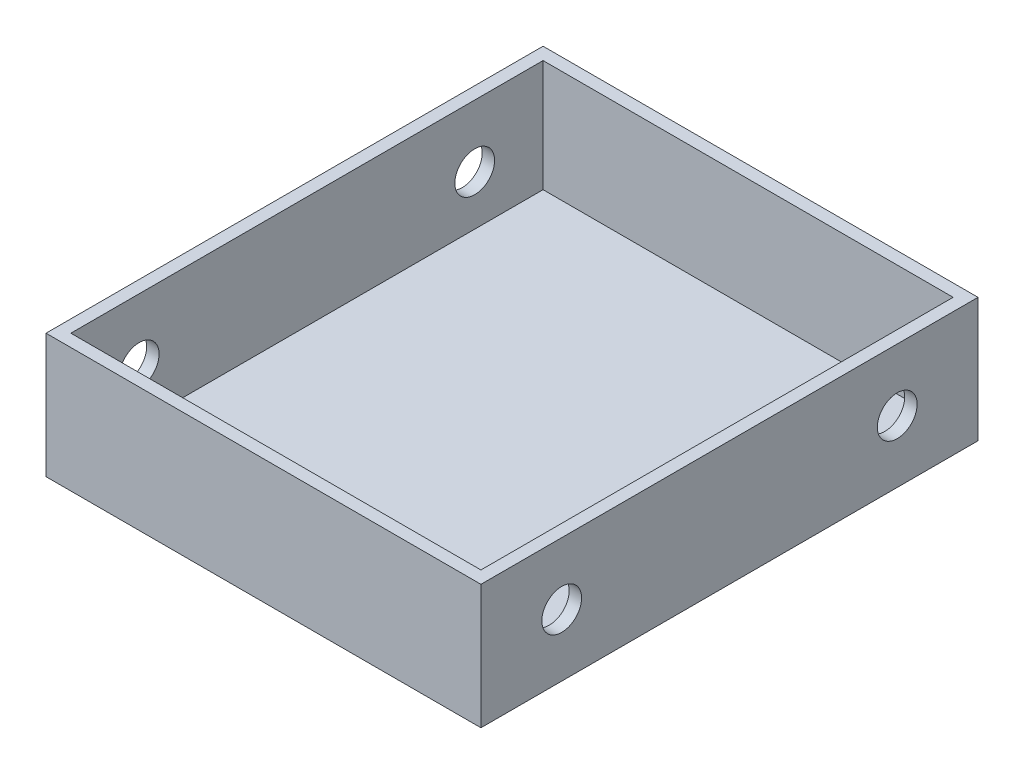
ISO-10303-21;
HEADER;
FILE_DESCRIPTION(('STEP AP214'),'2;1');
FILE_NAME('part.step','',(''),(''),'','','');
FILE_SCHEMA(('AUTOMOTIVE_DESIGN { 1 0 10303 214 1 1 1 1 }'));
ENDSEC;
DATA;
#1=APPLICATION_CONTEXT('core data for automotive mechanical design processes');
#2=APPLICATION_PROTOCOL_DEFINITION('international standard','automotive_design',2000,#1);
#3=PRODUCT_CONTEXT('',#1,'mechanical');
#4=PRODUCT('Part','Part','',(#3));
#5=PRODUCT_RELATED_PRODUCT_CATEGORY('part','',(#4));
#6=PRODUCT_DEFINITION_FORMATION('','',#4);
#7=PRODUCT_DEFINITION_CONTEXT('part definition',#1,'design');
#8=PRODUCT_DEFINITION('design','',#6,#7);
#9=PRODUCT_DEFINITION_SHAPE('','',#8);
#10=(LENGTH_UNIT() NAMED_UNIT(*) SI_UNIT(.MILLI.,.METRE.));
#11=(NAMED_UNIT(*) PLANE_ANGLE_UNIT() SI_UNIT($,.RADIAN.));
#12=(NAMED_UNIT(*) SI_UNIT($,.STERADIAN.) SOLID_ANGLE_UNIT());
#13=UNCERTAINTY_MEASURE_WITH_UNIT(LENGTH_MEASURE(1.E-05),#10,'distance_accuracy_value','');
#14=(GEOMETRIC_REPRESENTATION_CONTEXT(3) GLOBAL_UNCERTAINTY_ASSIGNED_CONTEXT((#13)) GLOBAL_UNIT_ASSIGNED_CONTEXT((#10,
#11,#12)) REPRESENTATION_CONTEXT('',''));
#15=CARTESIAN_POINT('',(0.,0.,0.));
#16=DIRECTION('',(0.,0.,1.));
#17=DIRECTION('',(1.,0.,0.));
#18=AXIS2_PLACEMENT_3D('',#15,#16,#17);
#19=CARTESIAN_POINT('',(0.,10.,0.));
#20=DIRECTION('',(0.,-1.,0.));
#21=DIRECTION('',(0.,0.,-1.));
#22=AXIS2_PLACEMENT_3D('',#19,#20,#21);
#23=PLANE('',#22);
#24=DIRECTION('',(0.,0.,1.));
#25=VECTOR('',#24,1.);
#26=CARTESIAN_POINT('',(0.,10.,0.));
#27=LINE('',#26,#25);
#28=CARTESIAN_POINT('',(0.,10.,-40.));
#29=VERTEX_POINT('',#28);
#30=CARTESIAN_POINT('',(0.,10.,0.));
#31=VERTEX_POINT('',#30);
#32=EDGE_CURVE('E145',#29,#31,#27,.T.);
#33=ORIENTED_EDGE('',*,*,#32,.T.);
#34=DIRECTION('',(1.,0.,0.));
#35=VECTOR('',#34,1.);
#36=CARTESIAN_POINT('',(0.,10.,0.));
#37=LINE('',#36,#35);
#38=CARTESIAN_POINT('',(35.,10.,0.));
#39=VERTEX_POINT('',#38);
#40=EDGE_CURVE('E89',#31,#39,#37,.T.);
#41=ORIENTED_EDGE('',*,*,#40,.T.);
#42=DIRECTION('',(0.,0.,-1.));
#43=VECTOR('',#42,1.);
#44=CARTESIAN_POINT('',(35.,10.,0.));
#45=LINE('',#44,#43);
#46=CARTESIAN_POINT('',(35.,10.,-40.));
#47=VERTEX_POINT('',#46);
#48=EDGE_CURVE('E148',#39,#47,#45,.T.);
#49=ORIENTED_EDGE('',*,*,#48,.T.);
#50=DIRECTION('',(-1.,0.,0.));
#51=VECTOR('',#50,1.);
#52=CARTESIAN_POINT('',(0.,10.,-40.));
#53=LINE('',#52,#51);
#54=EDGE_CURVE('E61',#47,#29,#53,.T.);
#55=ORIENTED_EDGE('',*,*,#54,.T.);
#56=EDGE_LOOP('',(#33,#41,#49,#55));
#57=FACE_BOUND('',#56,.T.);
#58=DIRECTION('',(0.,0.,1.));
#59=VECTOR('',#58,1.);
#60=CARTESIAN_POINT('',(1.,10.,0.));
#61=LINE('',#60,#59);
#62=CARTESIAN_POINT('',(0.999999999999993,10.,-39.));
#63=VERTEX_POINT('',#62);
#64=CARTESIAN_POINT('',(1.,10.,-1.));
#65=VERTEX_POINT('',#64);
#66=EDGE_CURVE('E134',#63,#65,#61,.T.);
#67=ORIENTED_EDGE('',*,*,#66,.F.);
#68=DIRECTION('',(-1.,0.,0.));
#69=VECTOR('',#68,1.);
#70=CARTESIAN_POINT('',(0.,10.,-39.));
#71=LINE('',#70,#69);
#72=CARTESIAN_POINT('',(34.,10.,-39.));
#73=VERTEX_POINT('',#72);
#74=EDGE_CURVE('E143',#73,#63,#71,.T.);
#75=ORIENTED_EDGE('',*,*,#74,.F.);
#76=DIRECTION('',(0.,0.,-1.));
#77=VECTOR('',#76,1.);
#78=CARTESIAN_POINT('',(34.,10.,0.));
#79=LINE('',#78,#77);
#80=CARTESIAN_POINT('',(34.,10.,-1.));
#81=VERTEX_POINT('',#80);
#82=EDGE_CURVE('E141',#81,#73,#79,.T.);
#83=ORIENTED_EDGE('',*,*,#82,.F.);
#84=DIRECTION('',(1.,0.,0.));
#85=VECTOR('',#84,1.);
#86=CARTESIAN_POINT('',(0.,10.,-1.));
#87=LINE('',#86,#85);
#88=EDGE_CURVE('E126',#65,#81,#87,.T.);
#89=ORIENTED_EDGE('',*,*,#88,.F.);
#90=EDGE_LOOP('',(#67,#75,#83,#89));
#91=FACE_BOUND('',#90,.T.);
#92=ADVANCED_FACE('F35',(#57,#91),#23,.F.);
#93=CARTESIAN_POINT('',(0.,10.,0.));
#94=DIRECTION('',(1.,0.,0.));
#95=DIRECTION('',(0.,0.,-1.));
#96=AXIS2_PLACEMENT_3D('',#93,#94,#95);
#97=PLANE('',#96);
#98=CARTESIAN_POINT('',(0.,5.,-33.5));
#99=DIRECTION('',(-1.,0.,0.));
#100=DIRECTION('',(0.,0.,1.));
#101=AXIS2_PLACEMENT_3D('',#98,#99,#100);
#102=CIRCLE('',#101,1.6);
#103=CARTESIAN_POINT('',(0.,5.,-31.9));
#104=VERTEX_POINT('',#103);
#105=EDGE_CURVE('E173',#104,#104,#102,.T.);
#106=ORIENTED_EDGE('',*,*,#105,.F.);
#107=EDGE_LOOP('',(#106));
#108=FACE_BOUND('',#107,.T.);
#109=CARTESIAN_POINT('',(0.,5.,-6.5));
#110=DIRECTION('',(-1.,0.,0.));
#111=DIRECTION('',(0.,0.,-1.));
#112=AXIS2_PLACEMENT_3D('',#109,#110,#111);
#113=CIRCLE('',#112,1.6);
#114=CARTESIAN_POINT('',(0.,5.,-8.1));
#115=VERTEX_POINT('',#114);
#116=EDGE_CURVE('E183',#115,#115,#113,.T.);
#117=ORIENTED_EDGE('',*,*,#116,.F.);
#118=EDGE_LOOP('',(#117));
#119=FACE_BOUND('',#118,.T.);
#120=DIRECTION('',(0.,0.,1.));
#121=VECTOR('',#120,1.);
#122=CARTESIAN_POINT('',(0.,0.,0.));
#123=LINE('',#122,#121);
#124=CARTESIAN_POINT('',(0.,0.,-40.));
#125=VERTEX_POINT('',#124);
#126=CARTESIAN_POINT('',(0.,0.,0.));
#127=VERTEX_POINT('',#126);
#128=EDGE_CURVE('E152',#125,#127,#123,.T.);
#129=ORIENTED_EDGE('',*,*,#128,.T.);
#130=DIRECTION('',(0.,-1.,0.));
#131=VECTOR('',#130,1.);
#132=CARTESIAN_POINT('',(0.,10.,0.));
#133=LINE('',#132,#131);
#134=EDGE_CURVE('E11',#31,#127,#133,.T.);
#135=ORIENTED_EDGE('',*,*,#134,.F.);
#136=ORIENTED_EDGE('',*,*,#32,.F.);
#137=DIRECTION('',(0.,-1.,0.));
#138=VECTOR('',#137,1.);
#139=CARTESIAN_POINT('',(0.,10.,-40.));
#140=LINE('',#139,#138);
#141=EDGE_CURVE('E151',#29,#125,#140,.T.);
#142=ORIENTED_EDGE('',*,*,#141,.T.);
#143=EDGE_LOOP('',(#129,#135,#136,#142));
#144=FACE_BOUND('',#143,.T.);
#145=ADVANCED_FACE('F37',(#108,#119,#144),#97,.F.);
#146=CARTESIAN_POINT('',(0.,10.,0.));
#147=DIRECTION('',(0.,0.,-1.));
#148=DIRECTION('',(-1.,0.,0.));
#149=AXIS2_PLACEMENT_3D('',#146,#147,#148);
#150=PLANE('',#149);
#151=DIRECTION('',(1.,0.,0.));
#152=VECTOR('',#151,1.);
#153=CARTESIAN_POINT('',(0.,0.,0.));
#154=LINE('',#153,#152);
#155=CARTESIAN_POINT('',(35.,0.,0.));
#156=VERTEX_POINT('',#155);
#157=EDGE_CURVE('E155',#127,#156,#154,.T.);
#158=ORIENTED_EDGE('',*,*,#157,.T.);
#159=DIRECTION('',(0.,-1.,0.));
#160=VECTOR('',#159,1.);
#161=CARTESIAN_POINT('',(35.,10.,0.));
#162=LINE('',#161,#160);
#163=EDGE_CURVE('E44',#39,#156,#162,.T.);
#164=ORIENTED_EDGE('',*,*,#163,.F.);
#165=ORIENTED_EDGE('',*,*,#40,.F.);
#166=ORIENTED_EDGE('',*,*,#134,.T.);
#167=EDGE_LOOP('',(#158,#164,#165,#166));
#168=FACE_BOUND('',#167,.T.);
#169=ADVANCED_FACE('F204',(#168),#150,.F.);
#170=CARTESIAN_POINT('',(35.,10.,0.));
#171=DIRECTION('',(-1.,0.,0.));
#172=DIRECTION('',(0.,0.,1.));
#173=AXIS2_PLACEMENT_3D('',#170,#171,#172);
#174=PLANE('',#173);
#175=CARTESIAN_POINT('',(35.,5.,-33.5));
#176=DIRECTION('',(-1.,0.,0.));
#177=DIRECTION('',(0.,0.,1.));
#178=AXIS2_PLACEMENT_3D('',#175,#176,#177);
#179=CIRCLE('',#178,1.6);
#180=CARTESIAN_POINT('',(35.,5.,-31.9));
#181=VERTEX_POINT('',#180);
#182=EDGE_CURVE('E167',#181,#181,#179,.T.);
#183=ORIENTED_EDGE('',*,*,#182,.T.);
#184=EDGE_LOOP('',(#183));
#185=FACE_BOUND('',#184,.T.);
#186=CARTESIAN_POINT('',(35.,5.,-6.50000000000002));
#187=DIRECTION('',(-1.,0.,0.));
#188=DIRECTION('',(0.,0.,-1.));
#189=AXIS2_PLACEMENT_3D('',#186,#187,#188);
#190=CIRCLE('',#189,1.6);
#191=CARTESIAN_POINT('',(35.,5.,-8.10000000000002));
#192=VERTEX_POINT('',#191);
#193=EDGE_CURVE('E178',#192,#192,#190,.T.);
#194=ORIENTED_EDGE('',*,*,#193,.T.);
#195=EDGE_LOOP('',(#194));
#196=FACE_BOUND('',#195,.T.);
#197=DIRECTION('',(0.,0.,-1.));
#198=VECTOR('',#197,1.);
#199=CARTESIAN_POINT('',(35.,0.,0.));
#200=LINE('',#199,#198);
#201=CARTESIAN_POINT('',(35.,0.,-40.));
#202=VERTEX_POINT('',#201);
#203=EDGE_CURVE('E157',#156,#202,#200,.T.);
#204=ORIENTED_EDGE('',*,*,#203,.T.);
#205=DIRECTION('',(0.,-1.,0.));
#206=VECTOR('',#205,1.);
#207=CARTESIAN_POINT('',(35.,10.,-40.));
#208=LINE('',#207,#206);
#209=EDGE_CURVE('E161',#47,#202,#208,.T.);
#210=ORIENTED_EDGE('',*,*,#209,.F.);
#211=ORIENTED_EDGE('',*,*,#48,.F.);
#212=ORIENTED_EDGE('',*,*,#163,.T.);
#213=EDGE_LOOP('',(#204,#210,#211,#212));
#214=FACE_BOUND('',#213,.T.);
#215=ADVANCED_FACE('F216',(#185,#196,#214),#174,.F.);
#216=CARTESIAN_POINT('',(0.,10.,-40.));
#217=DIRECTION('',(0.,0.,1.));
#218=DIRECTION('',(1.,0.,0.));
#219=AXIS2_PLACEMENT_3D('',#216,#217,#218);
#220=PLANE('',#219);
#221=DIRECTION('',(-1.,0.,0.));
#222=VECTOR('',#221,1.);
#223=CARTESIAN_POINT('',(0.,0.,-40.));
#224=LINE('',#223,#222);
#225=EDGE_CURVE('E82',#202,#125,#224,.T.);
#226=ORIENTED_EDGE('',*,*,#225,.T.);
#227=ORIENTED_EDGE('',*,*,#141,.F.);
#228=ORIENTED_EDGE('',*,*,#54,.F.);
#229=ORIENTED_EDGE('',*,*,#209,.T.);
#230=EDGE_LOOP('',(#226,#227,#228,#229));
#231=FACE_BOUND('',#230,.T.);
#232=ADVANCED_FACE('F212',(#231),#220,.F.);
#233=CARTESIAN_POINT('',(0.,0.,0.));
#234=DIRECTION('',(0.,-1.,0.));
#235=DIRECTION('',(0.,0.,-1.));
#236=AXIS2_PLACEMENT_3D('',#233,#234,#235);
#237=PLANE('',#236);
#238=ORIENTED_EDGE('',*,*,#128,.F.);
#239=ORIENTED_EDGE('',*,*,#225,.F.);
#240=ORIENTED_EDGE('',*,*,#203,.F.);
#241=ORIENTED_EDGE('',*,*,#157,.F.);
#242=EDGE_LOOP('',(#238,#239,#240,#241));
#243=FACE_BOUND('',#242,.T.);
#244=ADVANCED_FACE('F209',(#243),#237,.T.);
#245=CARTESIAN_POINT('',(1.,10.,0.));
#246=DIRECTION('',(1.,0.,0.));
#247=DIRECTION('',(0.,0.,-1.));
#248=AXIS2_PLACEMENT_3D('',#245,#246,#247);
#249=PLANE('',#248);
#250=CARTESIAN_POINT('',(0.999999999999994,5.,-33.5));
#251=DIRECTION('',(1.,0.,0.));
#252=DIRECTION('',(0.,0.,-1.));
#253=AXIS2_PLACEMENT_3D('',#250,#251,#252);
#254=CIRCLE('',#253,1.6);
#255=CARTESIAN_POINT('',(0.999999999999994,5.,-35.1));
#256=VERTEX_POINT('',#255);
#257=EDGE_CURVE('E186',#256,#256,#254,.T.);
#258=ORIENTED_EDGE('',*,*,#257,.F.);
#259=EDGE_LOOP('',(#258));
#260=FACE_BOUND('',#259,.T.);
#261=CARTESIAN_POINT('',(1.,5.,-6.5));
#262=DIRECTION('',(1.,0.,0.));
#263=DIRECTION('',(0.,0.,-1.));
#264=AXIS2_PLACEMENT_3D('',#261,#262,#263);
#265=CIRCLE('',#264,1.6);
#266=CARTESIAN_POINT('',(1.,5.,-8.1));
#267=VERTEX_POINT('',#266);
#268=EDGE_CURVE('E166',#267,#267,#265,.T.);
#269=ORIENTED_EDGE('',*,*,#268,.F.);
#270=EDGE_LOOP('',(#269));
#271=FACE_BOUND('',#270,.T.);
#272=DIRECTION('',(0.,0.,1.));
#273=VECTOR('',#272,1.);
#274=CARTESIAN_POINT('',(1.,1.,0.));
#275=LINE('',#274,#273);
#276=CARTESIAN_POINT('',(0.999999999999993,1.,-39.));
#277=VERTEX_POINT('',#276);
#278=CARTESIAN_POINT('',(1.,1.,-1.));
#279=VERTEX_POINT('',#278);
#280=EDGE_CURVE('E117',#277,#279,#275,.T.);
#281=ORIENTED_EDGE('',*,*,#280,.F.);
#282=DIRECTION('',(0.,-1.,0.));
#283=VECTOR('',#282,1.);
#284=CARTESIAN_POINT('',(0.999999999999993,10.,-39.));
#285=LINE('',#284,#283);
#286=EDGE_CURVE('E137',#63,#277,#285,.T.);
#287=ORIENTED_EDGE('',*,*,#286,.F.);
#288=ORIENTED_EDGE('',*,*,#66,.T.);
#289=DIRECTION('',(0.,-1.,0.));
#290=VECTOR('',#289,1.);
#291=CARTESIAN_POINT('',(1.,10.,-1.));
#292=LINE('',#291,#290);
#293=EDGE_CURVE('E129',#65,#279,#292,.T.);
#294=ORIENTED_EDGE('',*,*,#293,.T.);
#295=EDGE_LOOP('',(#281,#287,#288,#294));
#296=FACE_BOUND('',#295,.T.);
#297=ADVANCED_FACE('F197',(#260,#271,#296),#249,.T.);
#298=CARTESIAN_POINT('',(0.,10.,-1.));
#299=DIRECTION('',(0.,0.,-1.));
#300=DIRECTION('',(-1.,0.,0.));
#301=AXIS2_PLACEMENT_3D('',#298,#299,#300);
#302=PLANE('',#301);
#303=DIRECTION('',(1.,0.,0.));
#304=VECTOR('',#303,1.);
#305=CARTESIAN_POINT('',(0.,1.,-1.));
#306=LINE('',#305,#304);
#307=CARTESIAN_POINT('',(34.,1.,-1.));
#308=VERTEX_POINT('',#307);
#309=EDGE_CURVE('E111',#279,#308,#306,.T.);
#310=ORIENTED_EDGE('',*,*,#309,.F.);
#311=ORIENTED_EDGE('',*,*,#293,.F.);
#312=ORIENTED_EDGE('',*,*,#88,.T.);
#313=DIRECTION('',(0.,-1.,0.));
#314=VECTOR('',#313,1.);
#315=CARTESIAN_POINT('',(34.,10.,-1.));
#316=LINE('',#315,#314);
#317=EDGE_CURVE('E123',#81,#308,#316,.T.);
#318=ORIENTED_EDGE('',*,*,#317,.T.);
#319=EDGE_LOOP('',(#310,#311,#312,#318));
#320=FACE_BOUND('',#319,.T.);
#321=ADVANCED_FACE('F124',(#320),#302,.T.);
#322=CARTESIAN_POINT('',(34.,10.,0.));
#323=DIRECTION('',(-1.,0.,0.));
#324=DIRECTION('',(0.,0.,1.));
#325=AXIS2_PLACEMENT_3D('',#322,#323,#324);
#326=PLANE('',#325);
#327=CARTESIAN_POINT('',(34.,5.,-33.5));
#328=DIRECTION('',(-1.,0.,0.));
#329=DIRECTION('',(0.,0.,1.));
#330=AXIS2_PLACEMENT_3D('',#327,#328,#329);
#331=CIRCLE('',#330,1.6);
#332=CARTESIAN_POINT('',(34.,5.,-31.9));
#333=VERTEX_POINT('',#332);
#334=EDGE_CURVE('E39',#333,#333,#331,.T.);
#335=ORIENTED_EDGE('',*,*,#334,.F.);
#336=EDGE_LOOP('',(#335));
#337=FACE_BOUND('',#336,.T.);
#338=CARTESIAN_POINT('',(34.,5.,-6.50000000000002));
#339=DIRECTION('',(-1.,0.,0.));
#340=DIRECTION('',(0.,0.,1.));
#341=AXIS2_PLACEMENT_3D('',#338,#339,#340);
#342=CIRCLE('',#341,1.6);
#343=CARTESIAN_POINT('',(34.,5.,-4.90000000000002));
#344=VERTEX_POINT('',#343);
#345=EDGE_CURVE('E164',#344,#344,#342,.T.);
#346=ORIENTED_EDGE('',*,*,#345,.F.);
#347=EDGE_LOOP('',(#346));
#348=FACE_BOUND('',#347,.T.);
#349=DIRECTION('',(0.,0.,-1.));
#350=VECTOR('',#349,1.);
#351=CARTESIAN_POINT('',(34.,1.,0.));
#352=LINE('',#351,#350);
#353=CARTESIAN_POINT('',(34.,1.,-39.));
#354=VERTEX_POINT('',#353);
#355=EDGE_CURVE('E115',#308,#354,#352,.T.);
#356=ORIENTED_EDGE('',*,*,#355,.F.);
#357=ORIENTED_EDGE('',*,*,#317,.F.);
#358=ORIENTED_EDGE('',*,*,#82,.T.);
#359=DIRECTION('',(0.,-1.,0.));
#360=VECTOR('',#359,1.);
#361=CARTESIAN_POINT('',(34.,10.,-39.));
#362=LINE('',#361,#360);
#363=EDGE_CURVE('E52',#73,#354,#362,.T.);
#364=ORIENTED_EDGE('',*,*,#363,.T.);
#365=EDGE_LOOP('',(#356,#357,#358,#364));
#366=FACE_BOUND('',#365,.T.);
#367=ADVANCED_FACE('F131',(#337,#348,#366),#326,.T.);
#368=CARTESIAN_POINT('',(0.,10.,-39.));
#369=DIRECTION('',(0.,0.,1.));
#370=DIRECTION('',(1.,0.,0.));
#371=AXIS2_PLACEMENT_3D('',#368,#369,#370);
#372=PLANE('',#371);
#373=DIRECTION('',(-1.,0.,0.));
#374=VECTOR('',#373,1.);
#375=CARTESIAN_POINT('',(0.,1.,-39.));
#376=LINE('',#375,#374);
#377=EDGE_CURVE('E132',#354,#277,#376,.T.);
#378=ORIENTED_EDGE('',*,*,#377,.F.);
#379=ORIENTED_EDGE('',*,*,#363,.F.);
#380=ORIENTED_EDGE('',*,*,#74,.T.);
#381=ORIENTED_EDGE('',*,*,#286,.T.);
#382=EDGE_LOOP('',(#378,#379,#380,#381));
#383=FACE_BOUND('',#382,.T.);
#384=ADVANCED_FACE('F193',(#383),#372,.T.);
#385=CARTESIAN_POINT('',(0.,1.,0.));
#386=DIRECTION('',(0.,-1.,0.));
#387=DIRECTION('',(0.,0.,-1.));
#388=AXIS2_PLACEMENT_3D('',#385,#386,#387);
#389=PLANE('',#388);
#390=ORIENTED_EDGE('',*,*,#280,.T.);
#391=ORIENTED_EDGE('',*,*,#309,.T.);
#392=ORIENTED_EDGE('',*,*,#355,.T.);
#393=ORIENTED_EDGE('',*,*,#377,.T.);
#394=EDGE_LOOP('',(#390,#391,#392,#393));
#395=FACE_BOUND('',#394,.T.);
#396=ADVANCED_FACE('F113',(#395),#389,.F.);
#397=CARTESIAN_POINT('',(35.,5.,-6.50000000000002));
#398=DIRECTION('',(-1.,0.,0.));
#399=DIRECTION('',(0.,0.,1.));
#400=AXIS2_PLACEMENT_3D('',#397,#398,#399);
#401=CYLINDRICAL_SURFACE('',#400,1.6);
#402=ORIENTED_EDGE('',*,*,#345,.T.);
#403=EDGE_LOOP('',(#402));
#404=FACE_BOUND('',#403,.T.);
#405=ORIENTED_EDGE('',*,*,#193,.F.);
#406=EDGE_LOOP('',(#405));
#407=FACE_BOUND('',#406,.T.);
#408=ADVANCED_FACE('F275',(#404,#407),#401,.F.);
#409=CARTESIAN_POINT('',(35.,5.,-33.5));
#410=DIRECTION('',(-1.,0.,0.));
#411=DIRECTION('',(0.,0.,1.));
#412=AXIS2_PLACEMENT_3D('',#409,#410,#411);
#413=CYLINDRICAL_SURFACE('',#412,1.6);
#414=ORIENTED_EDGE('',*,*,#334,.T.);
#415=EDGE_LOOP('',(#414));
#416=FACE_BOUND('',#415,.T.);
#417=ORIENTED_EDGE('',*,*,#182,.F.);
#418=EDGE_LOOP('',(#417));
#419=FACE_BOUND('',#418,.T.);
#420=ADVANCED_FACE('F280',(#416,#419),#413,.F.);
#421=ORIENTED_EDGE('',*,*,#268,.T.);
#422=EDGE_LOOP('',(#421));
#423=FACE_BOUND('',#422,.T.);
#424=ORIENTED_EDGE('',*,*,#116,.T.);
#425=EDGE_LOOP('',(#424));
#426=FACE_BOUND('',#425,.T.);
#427=ADVANCED_FACE('F282',(#423,#426),#401,.F.);
#428=ORIENTED_EDGE('',*,*,#257,.T.);
#429=EDGE_LOOP('',(#428));
#430=FACE_BOUND('',#429,.T.);
#431=ORIENTED_EDGE('',*,*,#105,.T.);
#432=EDGE_LOOP('',(#431));
#433=FACE_BOUND('',#432,.T.);
#434=ADVANCED_FACE('F290',(#430,#433),#413,.F.);
#435=CLOSED_SHELL('',(#92,#145,#169,#215,#232,#244,#297,#321,#367,#384,#396,#408,#420,#427,#434));
#436=MANIFOLD_SOLID_BREP('B2',#435);
#437=ADVANCED_BREP_SHAPE_REPRESENTATION('',(#18,#436),#14);
#438=SHAPE_DEFINITION_REPRESENTATION(#9,#437);
ENDSEC;
END-ISO-10303-21;
